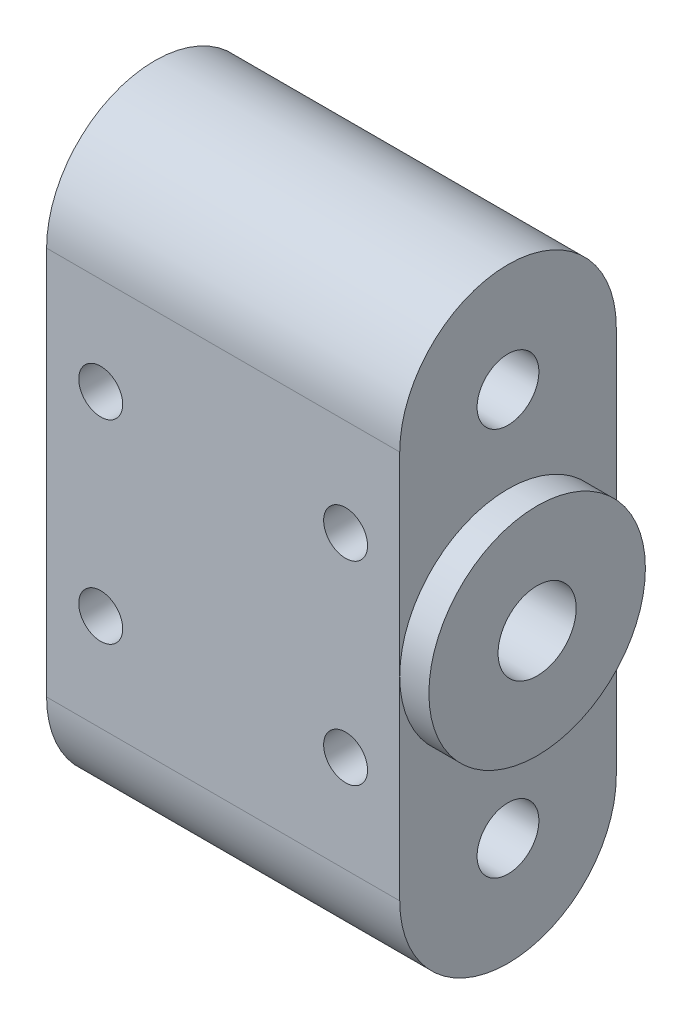
ISO-10303-21;
HEADER;
FILE_DESCRIPTION(('STEP AP214'),'2;1');
FILE_NAME('part.step','',(''),(''),'','','');
FILE_SCHEMA(('AUTOMOTIVE_DESIGN { 1 0 10303 214 1 1 1 1 }'));
ENDSEC;
DATA;
#1=APPLICATION_CONTEXT('core data for automotive mechanical design processes');
#2=APPLICATION_PROTOCOL_DEFINITION('international standard','automotive_design',2000,#1);
#3=PRODUCT_CONTEXT('',#1,'mechanical');
#4=PRODUCT('Part','Part','',(#3));
#5=PRODUCT_RELATED_PRODUCT_CATEGORY('part','',(#4));
#6=PRODUCT_DEFINITION_FORMATION('','',#4);
#7=PRODUCT_DEFINITION_CONTEXT('part definition',#1,'design');
#8=PRODUCT_DEFINITION('design','',#6,#7);
#9=PRODUCT_DEFINITION_SHAPE('','',#8);
#10=(LENGTH_UNIT() NAMED_UNIT(*) SI_UNIT(.MILLI.,.METRE.));
#11=(NAMED_UNIT(*) PLANE_ANGLE_UNIT() SI_UNIT($,.RADIAN.));
#12=(NAMED_UNIT(*) SI_UNIT($,.STERADIAN.) SOLID_ANGLE_UNIT());
#13=UNCERTAINTY_MEASURE_WITH_UNIT(LENGTH_MEASURE(1.E-05),#10,'distance_accuracy_value','');
#14=(GEOMETRIC_REPRESENTATION_CONTEXT(3) GLOBAL_UNCERTAINTY_ASSIGNED_CONTEXT((#13)) GLOBAL_UNIT_ASSIGNED_CONTEXT((#10,
#11,#12)) REPRESENTATION_CONTEXT('',''));
#15=CARTESIAN_POINT('',(0.,0.,0.));
#16=DIRECTION('',(0.,0.,1.));
#17=DIRECTION('',(1.,0.,0.));
#18=AXIS2_PLACEMENT_3D('',#15,#16,#17);
#19=CARTESIAN_POINT('',(23.075011,12.7,0.));
#20=DIRECTION('',(1.,0.,0.));
#21=DIRECTION('',(0.,0.,-1.));
#22=AXIS2_PLACEMENT_3D('',#19,#20,#21);
#23=PLANE('',#22);
#24=CARTESIAN_POINT('',(23.075011,12.7,0.));
#25=DIRECTION('',(1.,0.,0.));
#26=DIRECTION('',(0.,0.,-1.));
#27=AXIS2_PLACEMENT_3D('',#24,#25,#26);
#28=CIRCLE('',#27,2.0193);
#29=CARTESIAN_POINT('',(23.075011,12.7,-2.01929999999999));
#30=VERTEX_POINT('',#29);
#31=EDGE_CURVE('E170',#30,#30,#28,.T.);
#32=ORIENTED_EDGE('',*,*,#31,.F.);
#33=EDGE_LOOP('',(#32));
#34=FACE_BOUND('',#33,.T.);
#35=CARTESIAN_POINT('',(23.075011,0.,0.));
#36=DIRECTION('',(1.,0.,0.));
#37=DIRECTION('',(0.,0.,-1.));
#38=AXIS2_PLACEMENT_3D('',#35,#36,#37);
#39=CIRCLE('',#38,7.0739);
#40=CARTESIAN_POINT('',(23.075011,0.,-7.0739));
#41=VERTEX_POINT('',#40);
#42=CARTESIAN_POINT('',(23.075011,0.,7.0739));
#43=VERTEX_POINT('',#42);
#44=EDGE_CURVE('E60',#41,#43,#39,.T.);
#45=ORIENTED_EDGE('',*,*,#44,.F.);
#46=DIRECTION('',(0.,1.,0.));
#47=VECTOR('',#46,1.);
#48=CARTESIAN_POINT('',(23.075011,12.7,-7.0739));
#49=LINE('',#48,#47);
#50=CARTESIAN_POINT('',(23.075011,12.7,-7.0739));
#51=VERTEX_POINT('',#50);
#52=EDGE_CURVE('E78',#41,#51,#49,.T.);
#53=ORIENTED_EDGE('',*,*,#52,.T.);
#54=CARTESIAN_POINT('',(23.075011,12.7,0.));
#55=DIRECTION('',(1.,0.,0.));
#56=DIRECTION('',(0.,0.,-1.));
#57=AXIS2_PLACEMENT_3D('',#54,#55,#56);
#58=CIRCLE('',#57,7.0739);
#59=CARTESIAN_POINT('',(23.075011,12.7,7.0739));
#60=VERTEX_POINT('',#59);
#61=EDGE_CURVE('E189',#51,#60,#58,.T.);
#62=ORIENTED_EDGE('',*,*,#61,.T.);
#63=DIRECTION('',(0.,-1.,0.));
#64=VECTOR('',#63,1.);
#65=CARTESIAN_POINT('',(23.075011,12.7,7.0739));
#66=LINE('',#65,#64);
#67=EDGE_CURVE('E113',#60,#43,#66,.T.);
#68=ORIENTED_EDGE('',*,*,#67,.T.);
#69=EDGE_LOOP('',(#45,#53,#62,#68));
#70=FACE_BOUND('',#69,.T.);
#71=ADVANCED_FACE('F48',(#34,#70),#23,.T.);
#72=CARTESIAN_POINT('',(23.075011,12.7,0.));
#73=DIRECTION('',(-1.,0.,0.));
#74=DIRECTION('',(0.,0.,1.));
#75=AXIS2_PLACEMENT_3D('',#72,#73,#74);
#76=CYLINDRICAL_SURFACE('',#75,7.0739);
#77=CARTESIAN_POINT('',(0.,12.7,0.));
#78=DIRECTION('',(1.,0.,0.));
#79=DIRECTION('',(0.,0.,-1.));
#80=AXIS2_PLACEMENT_3D('',#77,#78,#79);
#81=CIRCLE('',#80,7.0739);
#82=CARTESIAN_POINT('',(0.,12.7,-7.0739));
#83=VERTEX_POINT('',#82);
#84=CARTESIAN_POINT('',(0.,12.7,7.0739));
#85=VERTEX_POINT('',#84);
#86=EDGE_CURVE('E187',#83,#85,#81,.T.);
#87=ORIENTED_EDGE('',*,*,#86,.T.);
#88=DIRECTION('',(-1.,0.,0.));
#89=VECTOR('',#88,1.);
#90=CARTESIAN_POINT('',(23.075011,12.7,7.0739));
#91=LINE('',#90,#89);
#92=EDGE_CURVE('E58',#60,#85,#91,.T.);
#93=ORIENTED_EDGE('',*,*,#92,.F.);
#94=ORIENTED_EDGE('',*,*,#61,.F.);
#95=DIRECTION('',(-1.,0.,0.));
#96=VECTOR('',#95,1.);
#97=CARTESIAN_POINT('',(23.075011,12.7,-7.0739));
#98=LINE('',#97,#96);
#99=EDGE_CURVE('E122',#51,#83,#98,.T.);
#100=ORIENTED_EDGE('',*,*,#99,.T.);
#101=EDGE_LOOP('',(#87,#93,#94,#100));
#102=FACE_BOUND('',#101,.T.);
#103=ADVANCED_FACE('F50',(#102),#76,.T.);
#104=CARTESIAN_POINT('',(23.075011,12.7,7.0739));
#105=DIRECTION('',(0.,0.,-1.));
#106=DIRECTION('',(0.,1.,0.));
#107=AXIS2_PLACEMENT_3D('',#104,#105,#106);
#108=PLANE('',#107);
#109=CARTESIAN_POINT('',(3.5375055,6.35,7.0739));
#110=DIRECTION('',(0.,0.,1.));
#111=DIRECTION('',(1.,0.,0.));
#112=AXIS2_PLACEMENT_3D('',#109,#110,#111);
#113=CIRCLE('',#112,1.43509999999999);
#114=CARTESIAN_POINT('',(4.97260549999999,6.35,7.0739));
#115=VERTEX_POINT('',#114);
#116=EDGE_CURVE('E221',#115,#115,#113,.T.);
#117=ORIENTED_EDGE('',*,*,#116,.F.);
#118=EDGE_LOOP('',(#117));
#119=FACE_BOUND('',#118,.T.);
#120=CARTESIAN_POINT('',(19.5375055,6.34999999999999,7.0739));
#121=DIRECTION('',(0.,0.,1.));
#122=DIRECTION('',(1.,0.,0.));
#123=AXIS2_PLACEMENT_3D('',#120,#121,#122);
#124=CIRCLE('',#123,1.43509999999999);
#125=CARTESIAN_POINT('',(20.9726055,6.34999999999999,7.0739));
#126=VERTEX_POINT('',#125);
#127=EDGE_CURVE('E243',#126,#126,#124,.T.);
#128=ORIENTED_EDGE('',*,*,#127,.F.);
#129=EDGE_LOOP('',(#128));
#130=FACE_BOUND('',#129,.T.);
#131=CARTESIAN_POINT('',(3.5375055,-6.35,7.0739));
#132=DIRECTION('',(0.,0.,1.));
#133=DIRECTION('',(1.,0.,0.));
#134=AXIS2_PLACEMENT_3D('',#131,#132,#133);
#135=CIRCLE('',#134,1.43509999999999);
#136=CARTESIAN_POINT('',(4.97260549999999,-6.35,7.0739));
#137=VERTEX_POINT('',#136);
#138=EDGE_CURVE('E251',#137,#137,#135,.T.);
#139=ORIENTED_EDGE('',*,*,#138,.F.);
#140=EDGE_LOOP('',(#139));
#141=FACE_BOUND('',#140,.T.);
#142=CARTESIAN_POINT('',(19.5375055,-6.35,7.0739));
#143=DIRECTION('',(0.,0.,1.));
#144=DIRECTION('',(1.,0.,0.));
#145=AXIS2_PLACEMENT_3D('',#142,#143,#144);
#146=CIRCLE('',#145,1.43509999999999);
#147=CARTESIAN_POINT('',(20.9726055,-6.35,7.0739));
#148=VERTEX_POINT('',#147);
#149=EDGE_CURVE('E259',#148,#148,#146,.T.);
#150=ORIENTED_EDGE('',*,*,#149,.F.);
#151=EDGE_LOOP('',(#150));
#152=FACE_BOUND('',#151,.T.);
#153=DIRECTION('',(0.,-1.,0.));
#154=VECTOR('',#153,1.);
#155=CARTESIAN_POINT('',(0.,12.7,7.0739));
#156=LINE('',#155,#154);
#157=CARTESIAN_POINT('',(0.,-12.7,7.0739));
#158=VERTEX_POINT('',#157);
#159=EDGE_CURVE('E200',#85,#158,#156,.T.);
#160=ORIENTED_EDGE('',*,*,#159,.T.);
#161=DIRECTION('',(-1.,0.,0.));
#162=VECTOR('',#161,1.);
#163=CARTESIAN_POINT('',(23.075011,-12.7,7.0739));
#164=LINE('',#163,#162);
#165=CARTESIAN_POINT('',(23.075011,-12.7,7.0739));
#166=VERTEX_POINT('',#165);
#167=EDGE_CURVE('E213',#166,#158,#164,.T.);
#168=ORIENTED_EDGE('',*,*,#167,.F.);
#169=EDGE_CURVE('E192',#43,#166,#66,.T.);
#170=ORIENTED_EDGE('',*,*,#169,.F.);
#171=ORIENTED_EDGE('',*,*,#67,.F.);
#172=ORIENTED_EDGE('',*,*,#92,.T.);
#173=EDGE_LOOP('',(#160,#168,#170,#171,#172));
#174=FACE_BOUND('',#173,.T.);
#175=ADVANCED_FACE('F153',(#119,#130,#141,#152,#174),#108,.F.);
#176=CARTESIAN_POINT('',(23.075011,-12.7,0.));
#177=DIRECTION('',(-1.,0.,0.));
#178=DIRECTION('',(0.,0.,1.));
#179=AXIS2_PLACEMENT_3D('',#176,#177,#178);
#180=CYLINDRICAL_SURFACE('',#179,7.0739);
#181=CARTESIAN_POINT('',(0.,-12.7,0.));
#182=DIRECTION('',(1.,0.,0.));
#183=DIRECTION('',(0.,0.,-1.));
#184=AXIS2_PLACEMENT_3D('',#181,#182,#183);
#185=CIRCLE('',#184,7.0739);
#186=CARTESIAN_POINT('',(0.,-12.7,-7.0739));
#187=VERTEX_POINT('',#186);
#188=EDGE_CURVE('E203',#158,#187,#185,.T.);
#189=ORIENTED_EDGE('',*,*,#188,.T.);
#190=DIRECTION('',(-1.,0.,0.));
#191=VECTOR('',#190,1.);
#192=CARTESIAN_POINT('',(23.075011,-12.7,-7.0739));
#193=LINE('',#192,#191);
#194=CARTESIAN_POINT('',(23.075011,-12.7,-7.0739));
#195=VERTEX_POINT('',#194);
#196=EDGE_CURVE('E210',#195,#187,#193,.T.);
#197=ORIENTED_EDGE('',*,*,#196,.F.);
#198=CARTESIAN_POINT('',(23.075011,-12.7,0.));
#199=DIRECTION('',(1.,0.,0.));
#200=DIRECTION('',(0.,0.,-1.));
#201=AXIS2_PLACEMENT_3D('',#198,#199,#200);
#202=CIRCLE('',#201,7.0739);
#203=EDGE_CURVE('E119',#166,#195,#202,.T.);
#204=ORIENTED_EDGE('',*,*,#203,.F.);
#205=ORIENTED_EDGE('',*,*,#167,.T.);
#206=EDGE_LOOP('',(#189,#197,#204,#205));
#207=FACE_BOUND('',#206,.T.);
#208=ADVANCED_FACE('F161',(#207),#180,.T.);
#209=CARTESIAN_POINT('',(23.075011,12.7,-7.0739));
#210=DIRECTION('',(0.,0.,1.));
#211=DIRECTION('',(0.,-1.,0.));
#212=AXIS2_PLACEMENT_3D('',#209,#210,#211);
#213=PLANE('',#212);
#214=CARTESIAN_POINT('',(3.5375055,6.35,-7.0739));
#215=DIRECTION('',(0.,0.,1.));
#216=DIRECTION('',(1.,0.,0.));
#217=AXIS2_PLACEMENT_3D('',#214,#215,#216);
#218=CIRCLE('',#217,1.4351);
#219=CARTESIAN_POINT('',(4.9726055,6.35,-7.0739));
#220=VERTEX_POINT('',#219);
#221=EDGE_CURVE('E228',#220,#220,#218,.T.);
#222=ORIENTED_EDGE('',*,*,#221,.T.);
#223=EDGE_LOOP('',(#222));
#224=FACE_BOUND('',#223,.T.);
#225=CARTESIAN_POINT('',(19.5375055,6.34999999999999,-7.0739));
#226=DIRECTION('',(0.,0.,1.));
#227=DIRECTION('',(1.,0.,0.));
#228=AXIS2_PLACEMENT_3D('',#225,#226,#227);
#229=CIRCLE('',#228,1.4351);
#230=CARTESIAN_POINT('',(20.9726055,6.34999999999999,-7.0739));
#231=VERTEX_POINT('',#230);
#232=EDGE_CURVE('E247',#231,#231,#229,.T.);
#233=ORIENTED_EDGE('',*,*,#232,.T.);
#234=EDGE_LOOP('',(#233));
#235=FACE_BOUND('',#234,.T.);
#236=CARTESIAN_POINT('',(3.5375055,-6.35,-7.0739));
#237=DIRECTION('',(0.,0.,1.));
#238=DIRECTION('',(1.,0.,0.));
#239=AXIS2_PLACEMENT_3D('',#236,#237,#238);
#240=CIRCLE('',#239,1.4351);
#241=CARTESIAN_POINT('',(4.97260549999999,-6.35,-7.0739));
#242=VERTEX_POINT('',#241);
#243=EDGE_CURVE('E255',#242,#242,#240,.T.);
#244=ORIENTED_EDGE('',*,*,#243,.T.);
#245=EDGE_LOOP('',(#244));
#246=FACE_BOUND('',#245,.T.);
#247=CARTESIAN_POINT('',(19.5375055,-6.35,-7.0739));
#248=DIRECTION('',(0.,0.,1.));
#249=DIRECTION('',(1.,0.,0.));
#250=AXIS2_PLACEMENT_3D('',#247,#248,#249);
#251=CIRCLE('',#250,1.4351);
#252=CARTESIAN_POINT('',(20.9726055,-6.35,-7.0739));
#253=VERTEX_POINT('',#252);
#254=EDGE_CURVE('E178',#253,#253,#251,.T.);
#255=ORIENTED_EDGE('',*,*,#254,.T.);
#256=EDGE_LOOP('',(#255));
#257=FACE_BOUND('',#256,.T.);
#258=DIRECTION('',(0.,1.,0.));
#259=VECTOR('',#258,1.);
#260=CARTESIAN_POINT('',(0.,12.7,-7.0739));
#261=LINE('',#260,#259);
#262=EDGE_CURVE('E106',#187,#83,#261,.T.);
#263=ORIENTED_EDGE('',*,*,#262,.T.);
#264=ORIENTED_EDGE('',*,*,#99,.F.);
#265=ORIENTED_EDGE('',*,*,#52,.F.);
#266=EDGE_CURVE('E116',#195,#41,#49,.T.);
#267=ORIENTED_EDGE('',*,*,#266,.F.);
#268=ORIENTED_EDGE('',*,*,#196,.T.);
#269=EDGE_LOOP('',(#263,#264,#265,#267,#268));
#270=FACE_BOUND('',#269,.T.);
#271=ADVANCED_FACE('F124',(#224,#235,#246,#257,#270),#213,.F.);
#272=CARTESIAN_POINT('',(23.075011,-12.7,0.));
#273=DIRECTION('',(1.,0.,0.));
#274=DIRECTION('',(0.,0.,-1.));
#275=AXIS2_PLACEMENT_3D('',#272,#273,#274);
#276=CIRCLE('',#275,2.0193);
#277=CARTESIAN_POINT('',(23.075011,-12.7,-2.0193));
#278=VERTEX_POINT('',#277);
#279=EDGE_CURVE('E166',#278,#278,#276,.T.);
#280=ORIENTED_EDGE('',*,*,#279,.F.);
#281=EDGE_LOOP('',(#280));
#282=FACE_BOUND('',#281,.T.);
#283=EDGE_CURVE('E11',#43,#41,#39,.T.);
#284=ORIENTED_EDGE('',*,*,#283,.F.);
#285=ORIENTED_EDGE('',*,*,#169,.T.);
#286=ORIENTED_EDGE('',*,*,#203,.T.);
#287=ORIENTED_EDGE('',*,*,#266,.T.);
#288=EDGE_LOOP('',(#284,#285,#286,#287));
#289=FACE_BOUND('',#288,.T.);
#290=ADVANCED_FACE('F117',(#282,#289),#23,.T.);
#291=CARTESIAN_POINT('',(0.,12.7,0.));
#292=DIRECTION('',(1.,0.,0.));
#293=DIRECTION('',(0.,0.,-1.));
#294=AXIS2_PLACEMENT_3D('',#291,#292,#293);
#295=PLANE('',#294);
#296=CARTESIAN_POINT('',(0.,-12.7,0.));
#297=DIRECTION('',(-1.,0.,0.));
#298=DIRECTION('',(0.,0.,1.));
#299=AXIS2_PLACEMENT_3D('',#296,#297,#298);
#300=CIRCLE('',#299,2.579751);
#301=CARTESIAN_POINT('',(0.,-12.7,2.579751));
#302=VERTEX_POINT('',#301);
#303=EDGE_CURVE('E554',#302,#302,#300,.T.);
#304=ORIENTED_EDGE('',*,*,#303,.F.);
#305=EDGE_LOOP('',(#304));
#306=FACE_BOUND('',#305,.T.);
#307=CARTESIAN_POINT('',(0.,12.7,0.));
#308=DIRECTION('',(-1.,0.,0.));
#309=DIRECTION('',(0.,0.,1.));
#310=AXIS2_PLACEMENT_3D('',#307,#308,#309);
#311=CIRCLE('',#310,2.579751);
#312=CARTESIAN_POINT('',(0.,12.7,2.57975100000001));
#313=VERTEX_POINT('',#312);
#314=EDGE_CURVE('E231',#313,#313,#311,.T.);
#315=ORIENTED_EDGE('',*,*,#314,.F.);
#316=EDGE_LOOP('',(#315));
#317=FACE_BOUND('',#316,.T.);
#318=CARTESIAN_POINT('',(0.,0.,0.));
#319=DIRECTION('',(1.,0.,0.));
#320=DIRECTION('',(0.,0.,-1.));
#321=AXIS2_PLACEMENT_3D('',#318,#319,#320);
#322=CIRCLE('',#321,2.55269999999999);
#323=CARTESIAN_POINT('',(0.,0.,-2.55269999999999));
#324=VERTEX_POINT('',#323);
#325=EDGE_CURVE('E131',#324,#324,#322,.T.);
#326=ORIENTED_EDGE('',*,*,#325,.T.);
#327=EDGE_LOOP('',(#326));
#328=FACE_BOUND('',#327,.T.);
#329=ORIENTED_EDGE('',*,*,#86,.F.);
#330=ORIENTED_EDGE('',*,*,#262,.F.);
#331=ORIENTED_EDGE('',*,*,#188,.F.);
#332=ORIENTED_EDGE('',*,*,#159,.F.);
#333=EDGE_LOOP('',(#329,#330,#331,#332));
#334=FACE_BOUND('',#333,.T.);
#335=ADVANCED_FACE('F135',(#306,#317,#328,#334),#295,.F.);
#336=CARTESIAN_POINT('',(24.980011,0.,0.));
#337=DIRECTION('',(-1.,0.,0.));
#338=DIRECTION('',(0.,0.,1.));
#339=AXIS2_PLACEMENT_3D('',#336,#337,#338);
#340=CYLINDRICAL_SURFACE('',#339,7.0739);
#341=CARTESIAN_POINT('',(24.980011,0.,0.));
#342=DIRECTION('',(1.,0.,0.));
#343=DIRECTION('',(0.,0.,-1.));
#344=AXIS2_PLACEMENT_3D('',#341,#342,#343);
#345=CIRCLE('',#344,7.0739);
#346=CARTESIAN_POINT('',(24.980011,0.,-7.0739));
#347=VERTEX_POINT('',#346);
#348=EDGE_CURVE('E130',#347,#347,#345,.T.);
#349=ORIENTED_EDGE('',*,*,#348,.F.);
#350=EDGE_LOOP('',(#349));
#351=FACE_BOUND('',#350,.T.);
#352=ORIENTED_EDGE('',*,*,#44,.T.);
#353=ORIENTED_EDGE('',*,*,#283,.T.);
#354=EDGE_LOOP('',(#352,#353));
#355=FACE_BOUND('',#354,.T.);
#356=ADVANCED_FACE('F132',(#351,#355),#340,.T.);
#357=CARTESIAN_POINT('',(24.980011,0.,0.));
#358=DIRECTION('',(1.,0.,0.));
#359=DIRECTION('',(0.,0.,-1.));
#360=AXIS2_PLACEMENT_3D('',#357,#358,#359);
#361=PLANE('',#360);
#362=CARTESIAN_POINT('',(24.980011,0.,0.));
#363=DIRECTION('',(1.,0.,0.));
#364=DIRECTION('',(0.,0.,-1.));
#365=AXIS2_PLACEMENT_3D('',#362,#363,#364);
#366=CIRCLE('',#365,2.55269999999999);
#367=CARTESIAN_POINT('',(24.980011,0.,-2.55269999999999));
#368=VERTEX_POINT('',#367);
#369=EDGE_CURVE('E169',#368,#368,#366,.T.);
#370=ORIENTED_EDGE('',*,*,#369,.F.);
#371=EDGE_LOOP('',(#370));
#372=FACE_BOUND('',#371,.T.);
#373=ORIENTED_EDGE('',*,*,#348,.T.);
#374=EDGE_LOOP('',(#373));
#375=FACE_BOUND('',#374,.T.);
#376=ADVANCED_FACE('F134',(#372,#375),#361,.T.);
#377=CARTESIAN_POINT('',(24.980011,0.,0.));
#378=DIRECTION('',(1.,0.,0.));
#379=DIRECTION('',(0.,0.,-1.));
#380=AXIS2_PLACEMENT_3D('',#377,#378,#379);
#381=CYLINDRICAL_SURFACE('',#380,2.55269999999999);
#382=ORIENTED_EDGE('',*,*,#325,.F.);
#383=EDGE_LOOP('',(#382));
#384=FACE_BOUND('',#383,.T.);
#385=ORIENTED_EDGE('',*,*,#369,.T.);
#386=EDGE_LOOP('',(#385));
#387=FACE_BOUND('',#386,.T.);
#388=ADVANCED_FACE('F142',(#384,#387),#381,.F.);
#389=CARTESIAN_POINT('',(23.075011,-12.7,0.));
#390=DIRECTION('',(1.,0.,0.));
#391=DIRECTION('',(0.,0.,-1.));
#392=AXIS2_PLACEMENT_3D('',#389,#390,#391);
#393=CYLINDRICAL_SURFACE('',#392,2.0193);
#394=CARTESIAN_POINT('',(3.51175293479462,-12.7,0.));
#395=DIRECTION('',(-1.,0.,0.));
#396=DIRECTION('',(0.,0.,1.));
#397=AXIS2_PLACEMENT_3D('',#394,#395,#396);
#398=CIRCLE('',#397,2.0193);
#399=CARTESIAN_POINT('',(3.51175293479462,-12.7,2.01929999999999));
#400=VERTEX_POINT('',#399);
#401=EDGE_CURVE('E52',#400,#400,#398,.T.);
#402=ORIENTED_EDGE('',*,*,#401,.T.);
#403=EDGE_LOOP('',(#402));
#404=FACE_BOUND('',#403,.T.);
#405=ORIENTED_EDGE('',*,*,#279,.T.);
#406=EDGE_LOOP('',(#405));
#407=FACE_BOUND('',#406,.T.);
#408=ADVANCED_FACE('F293',(#404,#407),#393,.F.);
#409=CARTESIAN_POINT('',(23.075011,12.7,0.));
#410=DIRECTION('',(1.,0.,0.));
#411=DIRECTION('',(0.,0.,-1.));
#412=AXIS2_PLACEMENT_3D('',#409,#410,#411);
#413=CYLINDRICAL_SURFACE('',#412,2.0193);
#414=CARTESIAN_POINT('',(3.51175293479462,12.7,0.));
#415=DIRECTION('',(-1.,0.,0.));
#416=DIRECTION('',(0.,0.,1.));
#417=AXIS2_PLACEMENT_3D('',#414,#415,#416);
#418=CIRCLE('',#417,2.0193);
#419=CARTESIAN_POINT('',(3.51175293479462,12.7,2.0193));
#420=VERTEX_POINT('',#419);
#421=EDGE_CURVE('E218',#420,#420,#418,.T.);
#422=ORIENTED_EDGE('',*,*,#421,.T.);
#423=EDGE_LOOP('',(#422));
#424=FACE_BOUND('',#423,.T.);
#425=ORIENTED_EDGE('',*,*,#31,.T.);
#426=EDGE_LOOP('',(#425));
#427=FACE_BOUND('',#426,.T.);
#428=ADVANCED_FACE('F269',(#424,#427),#413,.F.);
#429=CARTESIAN_POINT('',(19.5375055,-6.35,7.0739));
#430=DIRECTION('',(0.,0.,1.));
#431=DIRECTION('',(1.,0.,0.));
#432=AXIS2_PLACEMENT_3D('',#429,#430,#431);
#433=CYLINDRICAL_SURFACE('',#432,1.43509999999999);
#434=ORIENTED_EDGE('',*,*,#254,.F.);
#435=EDGE_LOOP('',(#434));
#436=FACE_BOUND('',#435,.T.);
#437=ORIENTED_EDGE('',*,*,#149,.T.);
#438=EDGE_LOOP('',(#437));
#439=FACE_BOUND('',#438,.T.);
#440=ADVANCED_FACE('F266',(#436,#439),#433,.F.);
#441=CARTESIAN_POINT('',(3.5375055,-6.35,7.0739));
#442=DIRECTION('',(0.,0.,1.));
#443=DIRECTION('',(1.,0.,0.));
#444=AXIS2_PLACEMENT_3D('',#441,#442,#443);
#445=CYLINDRICAL_SURFACE('',#444,1.43509999999999);
#446=ORIENTED_EDGE('',*,*,#243,.F.);
#447=EDGE_LOOP('',(#446));
#448=FACE_BOUND('',#447,.T.);
#449=ORIENTED_EDGE('',*,*,#138,.T.);
#450=EDGE_LOOP('',(#449));
#451=FACE_BOUND('',#450,.T.);
#452=ADVANCED_FACE('F268',(#448,#451),#445,.F.);
#453=CARTESIAN_POINT('',(19.5375055,6.34999999999999,7.0739));
#454=DIRECTION('',(0.,0.,1.));
#455=DIRECTION('',(1.,0.,0.));
#456=AXIS2_PLACEMENT_3D('',#453,#454,#455);
#457=CYLINDRICAL_SURFACE('',#456,1.43509999999999);
#458=ORIENTED_EDGE('',*,*,#232,.F.);
#459=EDGE_LOOP('',(#458));
#460=FACE_BOUND('',#459,.T.);
#461=ORIENTED_EDGE('',*,*,#127,.T.);
#462=EDGE_LOOP('',(#461));
#463=FACE_BOUND('',#462,.T.);
#464=ADVANCED_FACE('F320',(#460,#463),#457,.F.);
#465=CARTESIAN_POINT('',(3.5375055,6.35,7.0739));
#466=DIRECTION('',(0.,0.,1.));
#467=DIRECTION('',(1.,0.,0.));
#468=AXIS2_PLACEMENT_3D('',#465,#466,#467);
#469=CYLINDRICAL_SURFACE('',#468,1.43509999999999);
#470=ORIENTED_EDGE('',*,*,#221,.F.);
#471=EDGE_LOOP('',(#470));
#472=FACE_BOUND('',#471,.T.);
#473=ORIENTED_EDGE('',*,*,#116,.T.);
#474=EDGE_LOOP('',(#473));
#475=FACE_BOUND('',#474,.T.);
#476=ADVANCED_FACE('F313',(#472,#475),#469,.F.);
#477=CARTESIAN_POINT('',(3.175,12.7,0.));
#478=DIRECTION('',(-1.,0.,0.));
#479=DIRECTION('',(0.,0.,1.));
#480=AXIS2_PLACEMENT_3D('',#477,#478,#479);
#481=CONICAL_SURFACE('',#480,2.579751,1.02974425867665);
#482=CARTESIAN_POINT('',(3.175,12.7,0.));
#483=DIRECTION('',(-1.,0.,0.));
#484=DIRECTION('',(0.,0.,1.));
#485=AXIS2_PLACEMENT_3D('',#482,#483,#484);
#486=CIRCLE('',#485,2.579751);
#487=CARTESIAN_POINT('',(3.175,12.7,2.579751));
#488=VERTEX_POINT('',#487);
#489=EDGE_CURVE('E222',#488,#488,#486,.T.);
#490=ORIENTED_EDGE('',*,*,#489,.T.);
#491=EDGE_LOOP('',(#490));
#492=FACE_BOUND('',#491,.T.);
#493=ORIENTED_EDGE('',*,*,#421,.F.);
#494=EDGE_LOOP('',(#493));
#495=FACE_BOUND('',#494,.T.);
#496=ADVANCED_FACE('F319',(#492,#495),#481,.F.);
#497=CARTESIAN_POINT('',(0.,12.7,0.));
#498=DIRECTION('',(-1.,0.,0.));
#499=DIRECTION('',(0.,0.,1.));
#500=AXIS2_PLACEMENT_3D('',#497,#498,#499);
#501=CYLINDRICAL_SURFACE('',#500,2.579751);
#502=ORIENTED_EDGE('',*,*,#489,.F.);
#503=EDGE_LOOP('',(#502));
#504=FACE_BOUND('',#503,.T.);
#505=ORIENTED_EDGE('',*,*,#314,.T.);
#506=EDGE_LOOP('',(#505));
#507=FACE_BOUND('',#506,.T.);
#508=ADVANCED_FACE('F408',(#504,#507),#501,.F.);
#509=CARTESIAN_POINT('',(3.175,-12.7,0.));
#510=DIRECTION('',(-1.,0.,0.));
#511=DIRECTION('',(0.,0.,1.));
#512=AXIS2_PLACEMENT_3D('',#509,#510,#511);
#513=CONICAL_SURFACE('',#512,2.579751,1.02974425867665);
#514=CARTESIAN_POINT('',(3.175,-12.7,0.));
#515=DIRECTION('',(-1.,0.,0.));
#516=DIRECTION('',(0.,0.,1.));
#517=AXIS2_PLACEMENT_3D('',#514,#515,#516);
#518=CIRCLE('',#517,2.579751);
#519=CARTESIAN_POINT('',(3.175,-12.7,2.579751));
#520=VERTEX_POINT('',#519);
#521=EDGE_CURVE('E551',#520,#520,#518,.T.);
#522=ORIENTED_EDGE('',*,*,#521,.T.);
#523=EDGE_LOOP('',(#522));
#524=FACE_BOUND('',#523,.T.);
#525=ORIENTED_EDGE('',*,*,#401,.F.);
#526=EDGE_LOOP('',(#525));
#527=FACE_BOUND('',#526,.T.);
#528=ADVANCED_FACE('F289',(#524,#527),#513,.F.);
#529=CARTESIAN_POINT('',(0.,-12.7,0.));
#530=DIRECTION('',(-1.,0.,0.));
#531=DIRECTION('',(0.,0.,1.));
#532=AXIS2_PLACEMENT_3D('',#529,#530,#531);
#533=CYLINDRICAL_SURFACE('',#532,2.579751);
#534=ORIENTED_EDGE('',*,*,#521,.F.);
#535=EDGE_LOOP('',(#534));
#536=FACE_BOUND('',#535,.T.);
#537=ORIENTED_EDGE('',*,*,#303,.T.);
#538=EDGE_LOOP('',(#537));
#539=FACE_BOUND('',#538,.T.);
#540=ADVANCED_FACE('F416',(#536,#539),#533,.F.);
#541=CLOSED_SHELL('',(#71,#103,#175,#208,#271,#290,#335,#356,#376,#388,#408,#428,#440,#452,#464,
#476,#496,#508,#528,#540));
#542=MANIFOLD_SOLID_BREP('B2',#541);
#543=ADVANCED_BREP_SHAPE_REPRESENTATION('',(#18,#542),#14);
#544=SHAPE_DEFINITION_REPRESENTATION(#9,#543);
ENDSEC;
END-ISO-10303-21;
